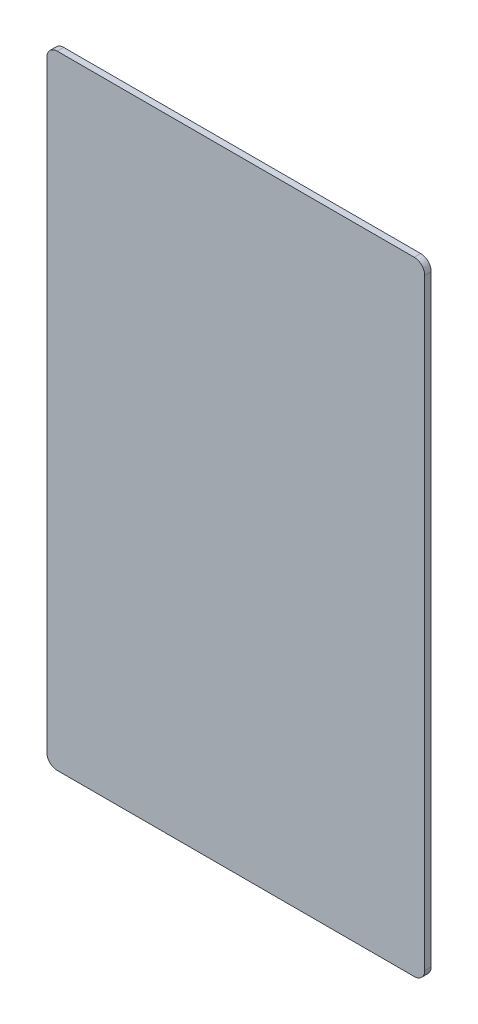
ISO-10303-21;
HEADER;
FILE_DESCRIPTION(('STEP AP214'),'2;1');
FILE_NAME('part.step','',(''),(''),'','','');
FILE_SCHEMA(('AUTOMOTIVE_DESIGN { 1 0 10303 214 1 1 1 1 }'));
ENDSEC;
DATA;
#1=APPLICATION_CONTEXT('core data for automotive mechanical design processes');
#2=APPLICATION_PROTOCOL_DEFINITION('international standard','automotive_design',2000,#1);
#3=PRODUCT_CONTEXT('',#1,'mechanical');
#4=PRODUCT('Part','Part','',(#3));
#5=PRODUCT_RELATED_PRODUCT_CATEGORY('part','',(#4));
#6=PRODUCT_DEFINITION_FORMATION('','',#4);
#7=PRODUCT_DEFINITION_CONTEXT('part definition',#1,'design');
#8=PRODUCT_DEFINITION('design','',#6,#7);
#9=PRODUCT_DEFINITION_SHAPE('','',#8);
#10=(LENGTH_UNIT() NAMED_UNIT(*) SI_UNIT(.MILLI.,.METRE.));
#11=(NAMED_UNIT(*) PLANE_ANGLE_UNIT() SI_UNIT($,.RADIAN.));
#12=(NAMED_UNIT(*) SI_UNIT($,.STERADIAN.) SOLID_ANGLE_UNIT());
#13=UNCERTAINTY_MEASURE_WITH_UNIT(LENGTH_MEASURE(1.E-05),#10,'distance_accuracy_value','');
#14=(GEOMETRIC_REPRESENTATION_CONTEXT(3) GLOBAL_UNCERTAINTY_ASSIGNED_CONTEXT((#13)) GLOBAL_UNIT_ASSIGNED_CONTEXT((#10,
#11,#12)) REPRESENTATION_CONTEXT('',''));
#15=CARTESIAN_POINT('',(0.,0.,0.));
#16=DIRECTION('',(0.,0.,1.));
#17=DIRECTION('',(1.,0.,0.));
#18=AXIS2_PLACEMENT_3D('',#15,#16,#17);
#19=CARTESIAN_POINT('',(-51.,-86.,1.85));
#20=DIRECTION('',(0.,0.,-1.));
#21=DIRECTION('',(-1.,0.,0.));
#22=AXIS2_PLACEMENT_3D('',#19,#20,#21);
#23=CYLINDRICAL_SURFACE('',#22,3.);
#24=CARTESIAN_POINT('',(-51.,-86.,0.));
#25=DIRECTION('',(0.,0.,1.));
#26=DIRECTION('',(-1.,0.,0.));
#27=AXIS2_PLACEMENT_3D('',#24,#25,#26);
#28=CIRCLE('',#27,3.);
#29=CARTESIAN_POINT('',(-54.,-86.,0.));
#30=VERTEX_POINT('',#29);
#31=CARTESIAN_POINT('',(-51.,-89.,0.));
#32=VERTEX_POINT('',#31);
#33=EDGE_CURVE('E191',#30,#32,#28,.T.);
#34=ORIENTED_EDGE('',*,*,#33,.T.);
#35=DIRECTION('',(0.,0.,-1.));
#36=VECTOR('',#35,1.);
#37=CARTESIAN_POINT('',(-51.,-89.,1.85));
#38=LINE('',#37,#36);
#39=CARTESIAN_POINT('',(-51.,-89.,1.85));
#40=VERTEX_POINT('',#39);
#41=EDGE_CURVE('E277',#40,#32,#38,.T.);
#42=ORIENTED_EDGE('',*,*,#41,.F.);
#43=CARTESIAN_POINT('',(-51.,-86.,1.85));
#44=DIRECTION('',(0.,0.,1.));
#45=DIRECTION('',(-1.,0.,0.));
#46=AXIS2_PLACEMENT_3D('',#43,#44,#45);
#47=CIRCLE('',#46,3.);
#48=CARTESIAN_POINT('',(-54.,-86.,1.85));
#49=VERTEX_POINT('',#48);
#50=EDGE_CURVE('E202',#49,#40,#47,.T.);
#51=ORIENTED_EDGE('',*,*,#50,.F.);
#52=DIRECTION('',(0.,0.,-1.));
#53=VECTOR('',#52,1.);
#54=CARTESIAN_POINT('',(-54.,-86.,1.85));
#55=LINE('',#54,#53);
#56=EDGE_CURVE('E230',#49,#30,#55,.T.);
#57=ORIENTED_EDGE('',*,*,#56,.T.);
#58=EDGE_LOOP('',(#34,#42,#51,#57));
#59=FACE_BOUND('',#58,.T.);
#60=ADVANCED_FACE('F59',(#59),#23,.T.);
#61=CARTESIAN_POINT('',(-51.,-89.,1.85));
#62=DIRECTION('',(0.,1.,0.));
#63=DIRECTION('',(0.,0.,1.));
#64=AXIS2_PLACEMENT_3D('',#61,#62,#63);
#65=PLANE('',#64);
#66=DIRECTION('',(1.,0.,0.));
#67=VECTOR('',#66,1.);
#68=CARTESIAN_POINT('',(-51.,-89.,0.));
#69=LINE('',#68,#67);
#70=CARTESIAN_POINT('',(51.,-89.,0.));
#71=VERTEX_POINT('',#70);
#72=EDGE_CURVE('E231',#32,#71,#69,.T.);
#73=ORIENTED_EDGE('',*,*,#72,.T.);
#74=DIRECTION('',(0.,0.,-1.));
#75=VECTOR('',#74,1.);
#76=CARTESIAN_POINT('',(51.,-89.,1.85));
#77=LINE('',#76,#75);
#78=CARTESIAN_POINT('',(51.,-89.,1.85));
#79=VERTEX_POINT('',#78);
#80=EDGE_CURVE('E272',#79,#71,#77,.T.);
#81=ORIENTED_EDGE('',*,*,#80,.F.);
#82=DIRECTION('',(1.,0.,0.));
#83=VECTOR('',#82,1.);
#84=CARTESIAN_POINT('',(-51.,-89.,1.85));
#85=LINE('',#84,#83);
#86=EDGE_CURVE('E203',#40,#79,#85,.T.);
#87=ORIENTED_EDGE('',*,*,#86,.F.);
#88=ORIENTED_EDGE('',*,*,#41,.T.);
#89=EDGE_LOOP('',(#73,#81,#87,#88));
#90=FACE_BOUND('',#89,.T.);
#91=ADVANCED_FACE('F300',(#90),#65,.F.);
#92=CARTESIAN_POINT('',(51.,-86.,1.85));
#93=DIRECTION('',(0.,0.,-1.));
#94=DIRECTION('',(-1.,0.,0.));
#95=AXIS2_PLACEMENT_3D('',#92,#93,#94);
#96=CYLINDRICAL_SURFACE('',#95,3.);
#97=CARTESIAN_POINT('',(51.,-86.,0.));
#98=DIRECTION('',(0.,0.,1.));
#99=DIRECTION('',(1.,0.,0.));
#100=AXIS2_PLACEMENT_3D('',#97,#98,#99);
#101=CIRCLE('',#100,3.);
#102=CARTESIAN_POINT('',(54.,-86.,0.));
#103=VERTEX_POINT('',#102);
#104=EDGE_CURVE('E233',#71,#103,#101,.T.);
#105=ORIENTED_EDGE('',*,*,#104,.T.);
#106=DIRECTION('',(0.,0.,-1.));
#107=VECTOR('',#106,1.);
#108=CARTESIAN_POINT('',(54.,-86.,1.85));
#109=LINE('',#108,#107);
#110=CARTESIAN_POINT('',(54.,-86.,1.85));
#111=VERTEX_POINT('',#110);
#112=EDGE_CURVE('E269',#111,#103,#109,.T.);
#113=ORIENTED_EDGE('',*,*,#112,.F.);
#114=CARTESIAN_POINT('',(51.,-86.,1.85));
#115=DIRECTION('',(0.,0.,1.));
#116=DIRECTION('',(1.,0.,0.));
#117=AXIS2_PLACEMENT_3D('',#114,#115,#116);
#118=CIRCLE('',#117,3.);
#119=EDGE_CURVE('E207',#79,#111,#118,.T.);
#120=ORIENTED_EDGE('',*,*,#119,.F.);
#121=ORIENTED_EDGE('',*,*,#80,.T.);
#122=EDGE_LOOP('',(#105,#113,#120,#121));
#123=FACE_BOUND('',#122,.T.);
#124=ADVANCED_FACE('F303',(#123),#96,.T.);
#125=CARTESIAN_POINT('',(54.,86.,1.85));
#126=DIRECTION('',(-1.,0.,0.));
#127=DIRECTION('',(0.,-1.,0.));
#128=AXIS2_PLACEMENT_3D('',#125,#126,#127);
#129=PLANE('',#128);
#130=DIRECTION('',(0.,1.,0.));
#131=VECTOR('',#130,1.);
#132=CARTESIAN_POINT('',(54.,86.,0.));
#133=LINE('',#132,#131);
#134=CARTESIAN_POINT('',(54.,86.,0.));
#135=VERTEX_POINT('',#134);
#136=EDGE_CURVE('E240',#103,#135,#133,.T.);
#137=ORIENTED_EDGE('',*,*,#136,.T.);
#138=DIRECTION('',(0.,0.,-1.));
#139=VECTOR('',#138,1.);
#140=CARTESIAN_POINT('',(54.,86.,1.85));
#141=LINE('',#140,#139);
#142=CARTESIAN_POINT('',(54.,86.,1.85));
#143=VERTEX_POINT('',#142);
#144=EDGE_CURVE('E266',#143,#135,#141,.T.);
#145=ORIENTED_EDGE('',*,*,#144,.F.);
#146=DIRECTION('',(0.,1.,0.));
#147=VECTOR('',#146,1.);
#148=CARTESIAN_POINT('',(54.,86.,1.85));
#149=LINE('',#148,#147);
#150=EDGE_CURVE('E212',#111,#143,#149,.T.);
#151=ORIENTED_EDGE('',*,*,#150,.F.);
#152=ORIENTED_EDGE('',*,*,#112,.T.);
#153=EDGE_LOOP('',(#137,#145,#151,#152));
#154=FACE_BOUND('',#153,.T.);
#155=ADVANCED_FACE('F340',(#154),#129,.F.);
#156=CARTESIAN_POINT('',(51.,86.,1.85));
#157=DIRECTION('',(0.,0.,-1.));
#158=DIRECTION('',(-1.,0.,0.));
#159=AXIS2_PLACEMENT_3D('',#156,#157,#158);
#160=CYLINDRICAL_SURFACE('',#159,3.);
#161=CARTESIAN_POINT('',(51.,86.,0.));
#162=DIRECTION('',(0.,0.,1.));
#163=DIRECTION('',(1.,0.,0.));
#164=AXIS2_PLACEMENT_3D('',#161,#162,#163);
#165=CIRCLE('',#164,3.);
#166=CARTESIAN_POINT('',(51.,89.,0.));
#167=VERTEX_POINT('',#166);
#168=EDGE_CURVE('E238',#135,#167,#165,.T.);
#169=ORIENTED_EDGE('',*,*,#168,.T.);
#170=DIRECTION('',(0.,0.,-1.));
#171=VECTOR('',#170,1.);
#172=CARTESIAN_POINT('',(51.,89.,1.85));
#173=LINE('',#172,#171);
#174=CARTESIAN_POINT('',(51.,89.,1.85));
#175=VERTEX_POINT('',#174);
#176=EDGE_CURVE('E265',#175,#167,#173,.T.);
#177=ORIENTED_EDGE('',*,*,#176,.F.);
#178=CARTESIAN_POINT('',(51.,86.,1.85));
#179=DIRECTION('',(0.,0.,1.));
#180=DIRECTION('',(1.,0.,0.));
#181=AXIS2_PLACEMENT_3D('',#178,#179,#180);
#182=CIRCLE('',#181,3.);
#183=EDGE_CURVE('E214',#143,#175,#182,.T.);
#184=ORIENTED_EDGE('',*,*,#183,.F.);
#185=ORIENTED_EDGE('',*,*,#144,.T.);
#186=EDGE_LOOP('',(#169,#177,#184,#185));
#187=FACE_BOUND('',#186,.T.);
#188=ADVANCED_FACE('F331',(#187),#160,.T.);
#189=CARTESIAN_POINT('',(-51.,89.,1.85));
#190=DIRECTION('',(0.,-1.,0.));
#191=DIRECTION('',(0.,0.,-1.));
#192=AXIS2_PLACEMENT_3D('',#189,#190,#191);
#193=PLANE('',#192);
#194=DIRECTION('',(-1.,0.,0.));
#195=VECTOR('',#194,1.);
#196=CARTESIAN_POINT('',(-51.,89.,0.));
#197=LINE('',#196,#195);
#198=CARTESIAN_POINT('',(-51.,89.,0.));
#199=VERTEX_POINT('',#198);
#200=EDGE_CURVE('E241',#167,#199,#197,.T.);
#201=ORIENTED_EDGE('',*,*,#200,.T.);
#202=DIRECTION('',(0.,0.,-1.));
#203=VECTOR('',#202,1.);
#204=CARTESIAN_POINT('',(-51.,89.,1.85));
#205=LINE('',#204,#203);
#206=CARTESIAN_POINT('',(-51.,89.,1.85));
#207=VERTEX_POINT('',#206);
#208=EDGE_CURVE('E256',#207,#199,#205,.T.);
#209=ORIENTED_EDGE('',*,*,#208,.F.);
#210=DIRECTION('',(-1.,0.,0.));
#211=VECTOR('',#210,1.);
#212=CARTESIAN_POINT('',(-51.,89.,1.85));
#213=LINE('',#212,#211);
#214=EDGE_CURVE('E216',#175,#207,#213,.T.);
#215=ORIENTED_EDGE('',*,*,#214,.F.);
#216=ORIENTED_EDGE('',*,*,#176,.T.);
#217=EDGE_LOOP('',(#201,#209,#215,#216));
#218=FACE_BOUND('',#217,.T.);
#219=ADVANCED_FACE('F329',(#218),#193,.F.);
#220=CARTESIAN_POINT('',(-51.,86.,1.85));
#221=DIRECTION('',(0.,0.,-1.));
#222=DIRECTION('',(-1.,0.,0.));
#223=AXIS2_PLACEMENT_3D('',#220,#221,#222);
#224=CYLINDRICAL_SURFACE('',#223,3.);
#225=CARTESIAN_POINT('',(-51.,86.,0.));
#226=DIRECTION('',(0.,0.,1.));
#227=DIRECTION('',(-1.,0.,0.));
#228=AXIS2_PLACEMENT_3D('',#225,#226,#227);
#229=CIRCLE('',#228,3.);
#230=CARTESIAN_POINT('',(-54.,86.,0.));
#231=VERTEX_POINT('',#230);
#232=EDGE_CURVE('E247',#199,#231,#229,.T.);
#233=ORIENTED_EDGE('',*,*,#232,.T.);
#234=DIRECTION('',(0.,0.,-1.));
#235=VECTOR('',#234,1.);
#236=CARTESIAN_POINT('',(-54.,86.,1.85));
#237=LINE('',#236,#235);
#238=CARTESIAN_POINT('',(-54.,86.,1.85));
#239=VERTEX_POINT('',#238);
#240=EDGE_CURVE('E252',#239,#231,#237,.T.);
#241=ORIENTED_EDGE('',*,*,#240,.F.);
#242=CARTESIAN_POINT('',(-51.,86.,1.85));
#243=DIRECTION('',(0.,0.,1.));
#244=DIRECTION('',(-1.,0.,0.));
#245=AXIS2_PLACEMENT_3D('',#242,#243,#244);
#246=CIRCLE('',#245,3.);
#247=EDGE_CURVE('E221',#207,#239,#246,.T.);
#248=ORIENTED_EDGE('',*,*,#247,.F.);
#249=ORIENTED_EDGE('',*,*,#208,.T.);
#250=EDGE_LOOP('',(#233,#241,#248,#249));
#251=FACE_BOUND('',#250,.T.);
#252=ADVANCED_FACE('F322',(#251),#224,.T.);
#253=CARTESIAN_POINT('',(-54.,86.,1.85));
#254=DIRECTION('',(1.,0.,0.));
#255=DIRECTION('',(0.,1.,0.));
#256=AXIS2_PLACEMENT_3D('',#253,#254,#255);
#257=PLANE('',#256);
#258=DIRECTION('',(0.,-1.,0.));
#259=VECTOR('',#258,1.);
#260=CARTESIAN_POINT('',(-54.,86.,0.));
#261=LINE('',#260,#259);
#262=EDGE_CURVE('E208',#231,#30,#261,.T.);
#263=ORIENTED_EDGE('',*,*,#262,.T.);
#264=ORIENTED_EDGE('',*,*,#56,.F.);
#265=DIRECTION('',(0.,-1.,0.));
#266=VECTOR('',#265,1.);
#267=CARTESIAN_POINT('',(-54.,86.,1.85));
#268=LINE('',#267,#266);
#269=EDGE_CURVE('E222',#239,#49,#268,.T.);
#270=ORIENTED_EDGE('',*,*,#269,.F.);
#271=ORIENTED_EDGE('',*,*,#240,.T.);
#272=EDGE_LOOP('',(#263,#264,#270,#271));
#273=FACE_BOUND('',#272,.T.);
#274=ADVANCED_FACE('F321',(#273),#257,.F.);
#275=CARTESIAN_POINT('',(-51.,-86.,1.85));
#276=DIRECTION('',(0.,0.,-1.));
#277=DIRECTION('',(-1.,0.,0.));
#278=AXIS2_PLACEMENT_3D('',#275,#276,#277);
#279=PLANE('',#278);
#280=ORIENTED_EDGE('',*,*,#50,.T.);
#281=ORIENTED_EDGE('',*,*,#86,.T.);
#282=ORIENTED_EDGE('',*,*,#119,.T.);
#283=ORIENTED_EDGE('',*,*,#150,.T.);
#284=ORIENTED_EDGE('',*,*,#183,.T.);
#285=ORIENTED_EDGE('',*,*,#214,.T.);
#286=ORIENTED_EDGE('',*,*,#247,.T.);
#287=ORIENTED_EDGE('',*,*,#269,.T.);
#288=EDGE_LOOP('',(#280,#281,#282,#283,#284,#285,#286,#287));
#289=FACE_BOUND('',#288,.T.);
#290=ADVANCED_FACE('F316',(#289),#279,.F.);
#291=CARTESIAN_POINT('',(-51.,-86.,0.));
#292=DIRECTION('',(0.,0.,-1.));
#293=DIRECTION('',(-1.,0.,0.));
#294=AXIS2_PLACEMENT_3D('',#291,#292,#293);
#295=PLANE('',#294);
#296=DIRECTION('',(0.,1.,0.));
#297=VECTOR('',#296,1.);
#298=CARTESIAN_POINT('',(-46.,-86.,0.));
#299=LINE('',#298,#297);
#300=CARTESIAN_POINT('',(-46.,-83.,0.));
#301=VERTEX_POINT('',#300);
#302=CARTESIAN_POINT('',(-46.,81.,0.));
#303=VERTEX_POINT('',#302);
#304=EDGE_CURVE('E11',#301,#303,#299,.T.);
#305=ORIENTED_EDGE('',*,*,#304,.F.);
#306=DIRECTION('',(-1.,0.,0.));
#307=VECTOR('',#306,1.);
#308=CARTESIAN_POINT('',(-51.,-83.,0.));
#309=LINE('',#308,#307);
#310=CARTESIAN_POINT('',(49.,-83.,0.));
#311=VERTEX_POINT('',#310);
#312=EDGE_CURVE('E163',#311,#301,#309,.T.);
#313=ORIENTED_EDGE('',*,*,#312,.F.);
#314=DIRECTION('',(0.,-1.,0.));
#315=VECTOR('',#314,1.);
#316=CARTESIAN_POINT('',(49.,-86.,0.));
#317=LINE('',#316,#315);
#318=CARTESIAN_POINT('',(49.,81.,0.));
#319=VERTEX_POINT('',#318);
#320=EDGE_CURVE('E80',#319,#311,#317,.T.);
#321=ORIENTED_EDGE('',*,*,#320,.F.);
#322=DIRECTION('',(1.,0.,0.));
#323=VECTOR('',#322,1.);
#324=CARTESIAN_POINT('',(-51.,81.,0.));
#325=LINE('',#324,#323);
#326=EDGE_CURVE('E67',#303,#319,#325,.T.);
#327=ORIENTED_EDGE('',*,*,#326,.F.);
#328=EDGE_LOOP('',(#305,#313,#321,#327));
#329=FACE_BOUND('',#328,.T.);
#330=ORIENTED_EDGE('',*,*,#33,.F.);
#331=ORIENTED_EDGE('',*,*,#262,.F.);
#332=ORIENTED_EDGE('',*,*,#232,.F.);
#333=ORIENTED_EDGE('',*,*,#200,.F.);
#334=ORIENTED_EDGE('',*,*,#168,.F.);
#335=ORIENTED_EDGE('',*,*,#136,.F.);
#336=ORIENTED_EDGE('',*,*,#104,.F.);
#337=ORIENTED_EDGE('',*,*,#72,.F.);
#338=EDGE_LOOP('',(#330,#331,#332,#333,#334,#335,#336,#337));
#339=FACE_BOUND('',#338,.T.);
#340=ADVANCED_FACE('F309',(#329,#339),#295,.T.);
#341=CARTESIAN_POINT('',(-46.,-83.,-3.9));
#342=DIRECTION('',(-1.,0.,0.));
#343=DIRECTION('',(0.,0.,1.));
#344=AXIS2_PLACEMENT_3D('',#341,#342,#343);
#345=PLANE('',#344);
#346=DIRECTION('',(0.,0.,1.));
#347=VECTOR('',#346,1.);
#348=CARTESIAN_POINT('',(-46.,-83.,-3.9));
#349=LINE('',#348,#347);
#350=CARTESIAN_POINT('',(-46.,-83.,-3.9));
#351=VERTEX_POINT('',#350);
#352=EDGE_CURVE('E157',#351,#301,#349,.T.);
#353=ORIENTED_EDGE('',*,*,#352,.T.);
#354=ORIENTED_EDGE('',*,*,#304,.T.);
#355=DIRECTION('',(0.,0.,1.));
#356=VECTOR('',#355,1.);
#357=CARTESIAN_POINT('',(-46.,81.,-3.9));
#358=LINE('',#357,#356);
#359=CARTESIAN_POINT('',(-46.,81.,-3.9));
#360=VERTEX_POINT('',#359);
#361=EDGE_CURVE('E181',#360,#303,#358,.T.);
#362=ORIENTED_EDGE('',*,*,#361,.F.);
#363=DIRECTION('',(0.,-1.,0.));
#364=VECTOR('',#363,1.);
#365=CARTESIAN_POINT('',(-46.,-83.,-3.9));
#366=LINE('',#365,#364);
#367=EDGE_CURVE('E171',#360,#351,#366,.T.);
#368=ORIENTED_EDGE('',*,*,#367,.T.);
#369=EDGE_LOOP('',(#353,#354,#362,#368));
#370=FACE_BOUND('',#369,.T.);
#371=ADVANCED_FACE('F177',(#370),#345,.T.);
#372=CARTESIAN_POINT('',(-46.,81.,-3.9));
#373=DIRECTION('',(0.,1.,0.));
#374=DIRECTION('',(0.,0.,1.));
#375=AXIS2_PLACEMENT_3D('',#372,#373,#374);
#376=PLANE('',#375);
#377=ORIENTED_EDGE('',*,*,#361,.T.);
#378=ORIENTED_EDGE('',*,*,#326,.T.);
#379=DIRECTION('',(0.,0.,1.));
#380=VECTOR('',#379,1.);
#381=CARTESIAN_POINT('',(49.,81.,-3.9));
#382=LINE('',#381,#380);
#383=CARTESIAN_POINT('',(49.,81.,-3.9));
#384=VERTEX_POINT('',#383);
#385=EDGE_CURVE('E193',#384,#319,#382,.T.);
#386=ORIENTED_EDGE('',*,*,#385,.F.);
#387=DIRECTION('',(-1.,0.,0.));
#388=VECTOR('',#387,1.);
#389=CARTESIAN_POINT('',(-46.,81.,-3.9));
#390=LINE('',#389,#388);
#391=EDGE_CURVE('E168',#384,#360,#390,.T.);
#392=ORIENTED_EDGE('',*,*,#391,.T.);
#393=EDGE_LOOP('',(#377,#378,#386,#392));
#394=FACE_BOUND('',#393,.T.);
#395=ADVANCED_FACE('F288',(#394),#376,.T.);
#396=CARTESIAN_POINT('',(49.,-83.,-3.9));
#397=DIRECTION('',(1.,0.,0.));
#398=DIRECTION('',(0.,0.,-1.));
#399=AXIS2_PLACEMENT_3D('',#396,#397,#398);
#400=PLANE('',#399);
#401=ORIENTED_EDGE('',*,*,#385,.T.);
#402=ORIENTED_EDGE('',*,*,#320,.T.);
#403=DIRECTION('',(0.,0.,1.));
#404=VECTOR('',#403,1.);
#405=CARTESIAN_POINT('',(49.,-83.,-3.9));
#406=LINE('',#405,#404);
#407=CARTESIAN_POINT('',(49.,-83.,-3.9));
#408=VERTEX_POINT('',#407);
#409=EDGE_CURVE('E164',#408,#311,#406,.T.);
#410=ORIENTED_EDGE('',*,*,#409,.F.);
#411=DIRECTION('',(0.,1.,0.));
#412=VECTOR('',#411,1.);
#413=CARTESIAN_POINT('',(49.,-83.,-3.9));
#414=LINE('',#413,#412);
#415=EDGE_CURVE('E176',#408,#384,#414,.T.);
#416=ORIENTED_EDGE('',*,*,#415,.T.);
#417=EDGE_LOOP('',(#401,#402,#410,#416));
#418=FACE_BOUND('',#417,.T.);
#419=ADVANCED_FACE('F286',(#418),#400,.T.);
#420=CARTESIAN_POINT('',(-46.,-83.,-3.9));
#421=DIRECTION('',(0.,-1.,0.));
#422=DIRECTION('',(0.,0.,-1.));
#423=AXIS2_PLACEMENT_3D('',#420,#421,#422);
#424=PLANE('',#423);
#425=ORIENTED_EDGE('',*,*,#409,.T.);
#426=ORIENTED_EDGE('',*,*,#312,.T.);
#427=ORIENTED_EDGE('',*,*,#352,.F.);
#428=DIRECTION('',(1.,0.,0.));
#429=VECTOR('',#428,1.);
#430=CARTESIAN_POINT('',(-46.,-83.,-3.9));
#431=LINE('',#430,#429);
#432=EDGE_CURVE('E158',#351,#408,#431,.T.);
#433=ORIENTED_EDGE('',*,*,#432,.T.);
#434=EDGE_LOOP('',(#425,#426,#427,#433));
#435=FACE_BOUND('',#434,.T.);
#436=ADVANCED_FACE('F159',(#435),#424,.T.);
#437=CARTESIAN_POINT('',(0.,0.,-3.9));
#438=DIRECTION('',(0.,0.,-1.));
#439=DIRECTION('',(-1.,0.,0.));
#440=AXIS2_PLACEMENT_3D('',#437,#438,#439);
#441=PLANE('',#440);
#442=ORIENTED_EDGE('',*,*,#367,.F.);
#443=ORIENTED_EDGE('',*,*,#391,.F.);
#444=ORIENTED_EDGE('',*,*,#415,.F.);
#445=ORIENTED_EDGE('',*,*,#432,.F.);
#446=EDGE_LOOP('',(#442,#443,#444,#445));
#447=FACE_BOUND('',#446,.T.);
#448=ADVANCED_FACE('F173',(#447),#441,.T.);
#449=CLOSED_SHELL('',(#60,#91,#124,#155,#188,#219,#252,#274,#290,#340,#371,#395,#419,#436,#448));
#450=MANIFOLD_SOLID_BREP('B2',#449);
#451=ADVANCED_BREP_SHAPE_REPRESENTATION('',(#18,#450),#14);
#452=SHAPE_DEFINITION_REPRESENTATION(#9,#451);
ENDSEC;
END-ISO-10303-21;
